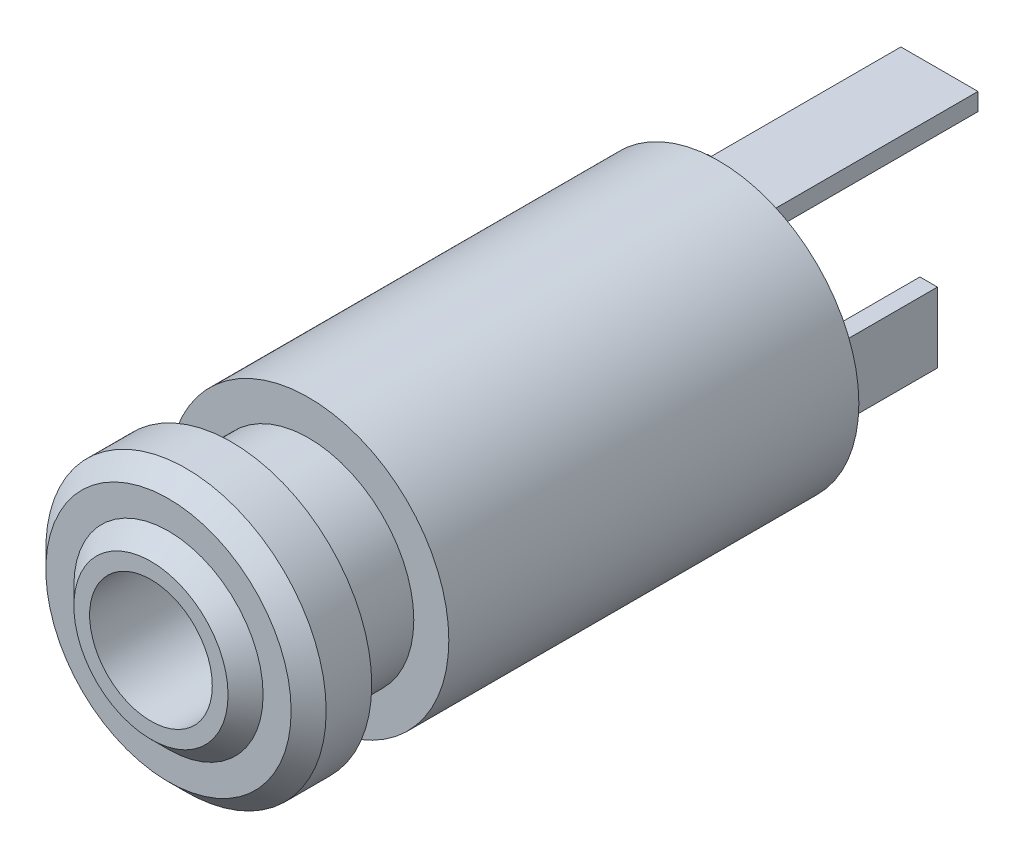
ISO-10303-21;
HEADER;
FILE_DESCRIPTION(('STEP AP214'),'2;1');
FILE_NAME('part.step','',(''),(''),'','','');
FILE_SCHEMA(('AUTOMOTIVE_DESIGN { 1 0 10303 214 1 1 1 1 }'));
ENDSEC;
DATA;
#1=APPLICATION_CONTEXT('core data for automotive mechanical design processes');
#2=APPLICATION_PROTOCOL_DEFINITION('international standard','automotive_design',2000,#1);
#3=PRODUCT_CONTEXT('',#1,'mechanical');
#4=PRODUCT('Part','Part','',(#3));
#5=PRODUCT_RELATED_PRODUCT_CATEGORY('part','',(#4));
#6=PRODUCT_DEFINITION_FORMATION('','',#4);
#7=PRODUCT_DEFINITION_CONTEXT('part definition',#1,'design');
#8=PRODUCT_DEFINITION('design','',#6,#7);
#9=PRODUCT_DEFINITION_SHAPE('','',#8);
#10=(LENGTH_UNIT() NAMED_UNIT(*) SI_UNIT(.MILLI.,.METRE.));
#11=(NAMED_UNIT(*) PLANE_ANGLE_UNIT() SI_UNIT($,.RADIAN.));
#12=(NAMED_UNIT(*) SI_UNIT($,.STERADIAN.) SOLID_ANGLE_UNIT());
#13=UNCERTAINTY_MEASURE_WITH_UNIT(LENGTH_MEASURE(1.E-05),#10,'distance_accuracy_value','');
#14=(GEOMETRIC_REPRESENTATION_CONTEXT(3) GLOBAL_UNCERTAINTY_ASSIGNED_CONTEXT((#13)) GLOBAL_UNIT_ASSIGNED_CONTEXT((#10,
#11,#12)) REPRESENTATION_CONTEXT('',''));
#15=CARTESIAN_POINT('',(0.,0.,0.));
#16=DIRECTION('',(0.,0.,1.));
#17=DIRECTION('',(1.,0.,0.));
#18=AXIS2_PLACEMENT_3D('',#15,#16,#17);
#19=CARTESIAN_POINT('',(0.,4.,-16.2));
#20=DIRECTION('',(0.,0.,1.));
#21=DIRECTION('',(1.,0.,0.));
#22=AXIS2_PLACEMENT_3D('',#19,#20,#21);
#23=PLANE('',#22);
#24=DIRECTION('',(0.,-1.,0.));
#25=VECTOR('',#24,1.);
#26=CARTESIAN_POINT('',(1.1,3.11281666914263,-16.2));
#27=LINE('',#26,#25);
#28=CARTESIAN_POINT('',(1.1,3.11281666914263,-16.2));
#29=VERTEX_POINT('',#28);
#30=CARTESIAN_POINT('',(1.1,2.61281666914263,-16.2));
#31=VERTEX_POINT('',#30);
#32=EDGE_CURVE('E188',#29,#31,#27,.T.);
#33=ORIENTED_EDGE('',*,*,#32,.F.);
#34=DIRECTION('',(1.,0.,0.));
#35=VECTOR('',#34,1.);
#36=CARTESIAN_POINT('',(1.1,3.11281666914263,-16.2));
#37=LINE('',#36,#35);
#38=CARTESIAN_POINT('',(-1.1,3.11281666914263,-16.2));
#39=VERTEX_POINT('',#38);
#40=EDGE_CURVE('E134',#39,#29,#37,.T.);
#41=ORIENTED_EDGE('',*,*,#40,.F.);
#42=DIRECTION('',(0.,1.,0.));
#43=VECTOR('',#42,1.);
#44=CARTESIAN_POINT('',(-1.1,3.11281666914263,-16.2));
#45=LINE('',#44,#43);
#46=CARTESIAN_POINT('',(-1.1,2.61281666914263,-16.2));
#47=VERTEX_POINT('',#46);
#48=EDGE_CURVE('E193',#47,#39,#45,.T.);
#49=ORIENTED_EDGE('',*,*,#48,.F.);
#50=DIRECTION('',(-1.,0.,0.));
#51=VECTOR('',#50,1.);
#52=CARTESIAN_POINT('',(1.1,2.61281666914263,-16.2));
#53=LINE('',#52,#51);
#54=EDGE_CURVE('E190',#31,#47,#53,.T.);
#55=ORIENTED_EDGE('',*,*,#54,.F.);
#56=EDGE_LOOP('',(#33,#41,#49,#55));
#57=FACE_BOUND('',#56,.T.);
#58=CARTESIAN_POINT('',(0.,0.,-16.2));
#59=DIRECTION('',(0.,0.,1.));
#60=DIRECTION('',(1.,0.,0.));
#61=AXIS2_PLACEMENT_3D('',#58,#59,#60);
#62=CIRCLE('',#61,4.);
#63=CARTESIAN_POINT('',(4.,0.,-16.2));
#64=VERTEX_POINT('',#63);
#65=EDGE_CURVE('E252',#64,#64,#62,.T.);
#66=ORIENTED_EDGE('',*,*,#65,.F.);
#67=EDGE_LOOP('',(#66));
#68=FACE_BOUND('',#67,.T.);
#69=DIRECTION('',(1.,0.,0.));
#70=VECTOR('',#69,1.);
#71=CARTESIAN_POINT('',(3.24320910821166,1.,-16.2));
#72=LINE('',#71,#70);
#73=CARTESIAN_POINT('',(2.74320910821166,1.,-16.2));
#74=VERTEX_POINT('',#73);
#75=CARTESIAN_POINT('',(3.24320910821166,1.,-16.2));
#76=VERTEX_POINT('',#75);
#77=EDGE_CURVE('E203',#74,#76,#72,.T.);
#78=ORIENTED_EDGE('',*,*,#77,.F.);
#79=DIRECTION('',(0.,1.,0.));
#80=VECTOR('',#79,1.);
#81=CARTESIAN_POINT('',(2.74320910821166,1.,-16.2));
#82=LINE('',#81,#80);
#83=CARTESIAN_POINT('',(2.74320910821166,-1.,-16.2));
#84=VERTEX_POINT('',#83);
#85=EDGE_CURVE('E208',#84,#74,#82,.T.);
#86=ORIENTED_EDGE('',*,*,#85,.F.);
#87=DIRECTION('',(-1.,0.,0.));
#88=VECTOR('',#87,1.);
#89=CARTESIAN_POINT('',(3.24320910821166,-1.,-16.2));
#90=LINE('',#89,#88);
#91=CARTESIAN_POINT('',(3.24320910821166,-1.,-16.2));
#92=VERTEX_POINT('',#91);
#93=EDGE_CURVE('E220',#92,#84,#90,.T.);
#94=ORIENTED_EDGE('',*,*,#93,.F.);
#95=DIRECTION('',(0.,-1.,0.));
#96=VECTOR('',#95,1.);
#97=CARTESIAN_POINT('',(3.24320910821166,1.,-16.2));
#98=LINE('',#97,#96);
#99=EDGE_CURVE('E217',#76,#92,#98,.T.);
#100=ORIENTED_EDGE('',*,*,#99,.F.);
#101=EDGE_LOOP('',(#78,#86,#94,#100));
#102=FACE_BOUND('',#101,.T.);
#103=DIRECTION('',(1.,0.,0.));
#104=VECTOR('',#103,1.);
#105=CARTESIAN_POINT('',(-2.6738017116088,1.,-16.2));
#106=LINE('',#105,#104);
#107=CARTESIAN_POINT('',(-3.31261650481451,1.,-16.2));
#108=VERTEX_POINT('',#107);
#109=CARTESIAN_POINT('',(-2.6738017116088,1.,-16.2));
#110=VERTEX_POINT('',#109);
#111=EDGE_CURVE('E157',#108,#110,#106,.T.);
#112=ORIENTED_EDGE('',*,*,#111,.F.);
#113=DIRECTION('',(0.,1.,0.));
#114=VECTOR('',#113,1.);
#115=CARTESIAN_POINT('',(-3.31261650481451,1.,-16.2));
#116=LINE('',#115,#114);
#117=CARTESIAN_POINT('',(-3.31261650481452,-0.999999999999999,-16.2));
#118=VERTEX_POINT('',#117);
#119=EDGE_CURVE('E162',#118,#108,#116,.T.);
#120=ORIENTED_EDGE('',*,*,#119,.F.);
#121=DIRECTION('',(-1.,0.,0.));
#122=VECTOR('',#121,1.);
#123=CARTESIAN_POINT('',(-2.6738017116088,-1.,-16.2));
#124=LINE('',#123,#122);
#125=CARTESIAN_POINT('',(-2.6738017116088,-1.,-16.2));
#126=VERTEX_POINT('',#125);
#127=EDGE_CURVE('E60',#126,#118,#124,.T.);
#128=ORIENTED_EDGE('',*,*,#127,.F.);
#129=DIRECTION('',(0.,-1.,0.));
#130=VECTOR('',#129,1.);
#131=CARTESIAN_POINT('',(-2.6738017116088,1.,-16.2));
#132=LINE('',#131,#130);
#133=EDGE_CURVE('E55',#110,#126,#132,.T.);
#134=ORIENTED_EDGE('',*,*,#133,.F.);
#135=EDGE_LOOP('',(#112,#120,#128,#134));
#136=FACE_BOUND('',#135,.T.);
#137=ADVANCED_FACE('F39',(#57,#68,#102,#136),#23,.F.);
#138=CARTESIAN_POINT('',(0.,1.75,-13.508423886849));
#139=DIRECTION('',(0.,0.,-1.));
#140=DIRECTION('',(-1.,0.,0.));
#141=AXIS2_PLACEMENT_3D('',#138,#139,#140);
#142=PLANE('',#141);
#143=CARTESIAN_POINT('',(0.,0.,-13.508423886849));
#144=DIRECTION('',(0.,0.,1.));
#145=DIRECTION('',(1.,0.,0.));
#146=AXIS2_PLACEMENT_3D('',#143,#144,#145);
#147=CIRCLE('',#146,1.75);
#148=CARTESIAN_POINT('',(1.75,0.,-13.508423886849));
#149=VERTEX_POINT('',#148);
#150=EDGE_CURVE('E249',#149,#149,#147,.T.);
#151=ORIENTED_EDGE('',*,*,#150,.T.);
#152=EDGE_LOOP('',(#151));
#153=FACE_BOUND('',#152,.T.);
#154=ADVANCED_FACE('F285',(#153),#142,.F.);
#155=CARTESIAN_POINT('',(0.,0.,3.98507462686567));
#156=DIRECTION('',(0.,0.,1.));
#157=DIRECTION('',(1.,0.,0.));
#158=AXIS2_PLACEMENT_3D('',#155,#156,#157);
#159=CYLINDRICAL_SURFACE('',#158,1.75);
#160=ORIENTED_EDGE('',*,*,#150,.F.);
#161=EDGE_LOOP('',(#160));
#162=FACE_BOUND('',#161,.T.);
#163=CARTESIAN_POINT('',(0.,0.,0.));
#164=DIRECTION('',(0.,0.,1.));
#165=DIRECTION('',(1.,0.,0.));
#166=AXIS2_PLACEMENT_3D('',#163,#164,#165);
#167=CIRCLE('',#166,1.75);
#168=CARTESIAN_POINT('',(1.75,0.,0.));
#169=VERTEX_POINT('',#168);
#170=EDGE_CURVE('E246',#169,#169,#167,.T.);
#171=ORIENTED_EDGE('',*,*,#170,.T.);
#172=EDGE_LOOP('',(#171));
#173=FACE_BOUND('',#172,.T.);
#174=ADVANCED_FACE('F292',(#162,#173),#159,.F.);
#175=CARTESIAN_POINT('',(0.,1.75,0.));
#176=DIRECTION('',(0.,0.,-1.));
#177=DIRECTION('',(-1.,0.,0.));
#178=AXIS2_PLACEMENT_3D('',#175,#176,#177);
#179=PLANE('',#178);
#180=ORIENTED_EDGE('',*,*,#170,.F.);
#181=EDGE_LOOP('',(#180));
#182=FACE_BOUND('',#181,.T.);
#183=CARTESIAN_POINT('',(0.,0.,0.));
#184=DIRECTION('',(0.,0.,1.));
#185=DIRECTION('',(1.,0.,0.));
#186=AXIS2_PLACEMENT_3D('',#183,#184,#185);
#187=CIRCLE('',#186,2.2);
#188=CARTESIAN_POINT('',(2.2,0.,0.));
#189=VERTEX_POINT('',#188);
#190=EDGE_CURVE('E243',#189,#189,#187,.T.);
#191=ORIENTED_EDGE('',*,*,#190,.T.);
#192=EDGE_LOOP('',(#191));
#193=FACE_BOUND('',#192,.T.);
#194=ADVANCED_FACE('F378',(#182,#193),#179,.F.);
#195=CARTESIAN_POINT('',(0.,0.,-0.8));
#196=DIRECTION('',(0.,0.,-1.));
#197=DIRECTION('',(-1.,0.,0.));
#198=AXIS2_PLACEMENT_3D('',#195,#196,#197);
#199=CONICAL_SURFACE('',#198,3.,0.785398163397448);
#200=CARTESIAN_POINT('',(0.,0.,-0.5));
#201=DIRECTION('',(0.,0.,1.));
#202=DIRECTION('',(1.,0.,0.));
#203=AXIS2_PLACEMENT_3D('',#200,#201,#202);
#204=CIRCLE('',#203,2.7);
#205=CARTESIAN_POINT('',(2.7,0.,-0.5));
#206=VERTEX_POINT('',#205);
#207=EDGE_CURVE('E239',#206,#206,#204,.T.);
#208=ORIENTED_EDGE('',*,*,#207,.T.);
#209=EDGE_LOOP('',(#208));
#210=FACE_BOUND('',#209,.T.);
#211=ORIENTED_EDGE('',*,*,#190,.F.);
#212=EDGE_LOOP('',(#211));
#213=FACE_BOUND('',#212,.T.);
#214=ADVANCED_FACE('F373',(#210,#213),#199,.T.);
#215=CARTESIAN_POINT('',(0.,0.,-2.3));
#216=DIRECTION('',(0.,0.,1.));
#217=DIRECTION('',(1.,0.,0.));
#218=AXIS2_PLACEMENT_3D('',#215,#216,#217);
#219=CYLINDRICAL_SURFACE('',#218,4.);
#220=CARTESIAN_POINT('',(0.,0.,-1.));
#221=DIRECTION('',(0.,0.,1.));
#222=DIRECTION('',(1.,0.,0.));
#223=AXIS2_PLACEMENT_3D('',#220,#221,#222);
#224=CIRCLE('',#223,4.);
#225=CARTESIAN_POINT('',(4.,0.,-1.));
#226=VERTEX_POINT('',#225);
#227=EDGE_CURVE('E11',#226,#226,#224,.F.);
#228=ORIENTED_EDGE('',*,*,#227,.T.);
#229=EDGE_LOOP('',(#228));
#230=FACE_BOUND('',#229,.T.);
#231=CARTESIAN_POINT('',(0.,0.,-2.3));
#232=DIRECTION('',(0.,0.,1.));
#233=DIRECTION('',(1.,0.,0.));
#234=AXIS2_PLACEMENT_3D('',#231,#232,#233);
#235=CIRCLE('',#234,4.);
#236=CARTESIAN_POINT('',(4.,0.,-2.3));
#237=VERTEX_POINT('',#236);
#238=EDGE_CURVE('E236',#237,#237,#235,.T.);
#239=ORIENTED_EDGE('',*,*,#238,.T.);
#240=EDGE_LOOP('',(#239));
#241=FACE_BOUND('',#240,.T.);
#242=ADVANCED_FACE('F368',(#230,#241),#219,.T.);
#243=CARTESIAN_POINT('',(0.,0.,-2.3));
#244=DIRECTION('',(0.,0.,1.));
#245=DIRECTION('',(1.,0.,0.));
#246=AXIS2_PLACEMENT_3D('',#243,#244,#245);
#247=PLANE('',#246);
#248=CARTESIAN_POINT('',(0.,0.,-2.3));
#249=DIRECTION('',(0.,0.,1.));
#250=DIRECTION('',(1.,0.,0.));
#251=AXIS2_PLACEMENT_3D('',#248,#249,#250);
#252=CIRCLE('',#251,3.);
#253=CARTESIAN_POINT('',(3.,0.,-2.3));
#254=VERTEX_POINT('',#253);
#255=EDGE_CURVE('E258',#254,#254,#252,.T.);
#256=ORIENTED_EDGE('',*,*,#255,.T.);
#257=EDGE_LOOP('',(#256));
#258=FACE_BOUND('',#257,.T.);
#259=ORIENTED_EDGE('',*,*,#238,.F.);
#260=EDGE_LOOP('',(#259));
#261=FACE_BOUND('',#260,.T.);
#262=ADVANCED_FACE('F365',(#258,#261),#247,.F.);
#263=CARTESIAN_POINT('',(0.,0.,-0.5));
#264=DIRECTION('',(0.,0.,1.));
#265=DIRECTION('',(1.,0.,0.));
#266=AXIS2_PLACEMENT_3D('',#263,#264,#265);
#267=PLANE('',#266);
#268=CARTESIAN_POINT('',(0.,0.,-0.5));
#269=DIRECTION('',(0.,0.,1.));
#270=DIRECTION('',(1.,0.,0.));
#271=AXIS2_PLACEMENT_3D('',#268,#269,#270);
#272=CIRCLE('',#271,3.5);
#273=CARTESIAN_POINT('',(3.5,0.,-0.5));
#274=VERTEX_POINT('',#273);
#275=EDGE_CURVE('E47',#274,#274,#272,.T.);
#276=ORIENTED_EDGE('',*,*,#275,.T.);
#277=EDGE_LOOP('',(#276));
#278=FACE_BOUND('',#277,.T.);
#279=ORIENTED_EDGE('',*,*,#207,.F.);
#280=EDGE_LOOP('',(#279));
#281=FACE_BOUND('',#280,.T.);
#282=ADVANCED_FACE('F265',(#278,#281),#267,.T.);
#283=CARTESIAN_POINT('',(0.,0.,3.98507462686567));
#284=DIRECTION('',(0.,0.,1.));
#285=DIRECTION('',(1.,0.,0.));
#286=AXIS2_PLACEMENT_3D('',#283,#284,#285);
#287=CYLINDRICAL_SURFACE('',#286,4.);
#288=CARTESIAN_POINT('',(0.,0.,-4.5));
#289=DIRECTION('',(0.,0.,1.));
#290=DIRECTION('',(1.,0.,0.));
#291=AXIS2_PLACEMENT_3D('',#288,#289,#290);
#292=CIRCLE('',#291,4.);
#293=CARTESIAN_POINT('',(4.,0.,-4.5));
#294=VERTEX_POINT('',#293);
#295=EDGE_CURVE('E255',#294,#294,#292,.T.);
#296=ORIENTED_EDGE('',*,*,#295,.F.);
#297=EDGE_LOOP('',(#296));
#298=FACE_BOUND('',#297,.T.);
#299=ORIENTED_EDGE('',*,*,#65,.T.);
#300=EDGE_LOOP('',(#299));
#301=FACE_BOUND('',#300,.T.);
#302=ADVANCED_FACE('F298',(#298,#301),#287,.T.);
#303=CARTESIAN_POINT('',(0.,3.,-4.5));
#304=DIRECTION('',(0.,0.,-1.));
#305=DIRECTION('',(-1.,0.,0.));
#306=AXIS2_PLACEMENT_3D('',#303,#304,#305);
#307=PLANE('',#306);
#308=CARTESIAN_POINT('',(0.,0.,-4.5));
#309=DIRECTION('',(0.,0.,1.));
#310=DIRECTION('',(1.,0.,0.));
#311=AXIS2_PLACEMENT_3D('',#308,#309,#310);
#312=CIRCLE('',#311,3.);
#313=CARTESIAN_POINT('',(3.,0.,-4.5));
#314=VERTEX_POINT('',#313);
#315=EDGE_CURVE('E240',#314,#314,#312,.T.);
#316=ORIENTED_EDGE('',*,*,#315,.F.);
#317=EDGE_LOOP('',(#316));
#318=FACE_BOUND('',#317,.T.);
#319=ORIENTED_EDGE('',*,*,#295,.T.);
#320=EDGE_LOOP('',(#319));
#321=FACE_BOUND('',#320,.T.);
#322=ADVANCED_FACE('F280',(#318,#321),#307,.F.);
#323=CARTESIAN_POINT('',(0.,0.,3.98507462686567));
#324=DIRECTION('',(0.,0.,1.));
#325=DIRECTION('',(1.,0.,0.));
#326=AXIS2_PLACEMENT_3D('',#323,#324,#325);
#327=CYLINDRICAL_SURFACE('',#326,3.);
#328=ORIENTED_EDGE('',*,*,#315,.T.);
#329=EDGE_LOOP('',(#328));
#330=FACE_BOUND('',#329,.T.);
#331=ORIENTED_EDGE('',*,*,#255,.F.);
#332=EDGE_LOOP('',(#331));
#333=FACE_BOUND('',#332,.T.);
#334=ADVANCED_FACE('F270',(#330,#333),#327,.T.);
#335=CARTESIAN_POINT('',(0.,0.,-0.5));
#336=DIRECTION('',(0.,0.,-1.));
#337=DIRECTION('',(-1.,0.,0.));
#338=AXIS2_PLACEMENT_3D('',#335,#336,#337);
#339=CONICAL_SURFACE('',#338,3.5,0.785398163397445);
#340=ORIENTED_EDGE('',*,*,#227,.F.);
#341=EDGE_LOOP('',(#340));
#342=FACE_BOUND('',#341,.T.);
#343=ORIENTED_EDGE('',*,*,#275,.F.);
#344=EDGE_LOOP('',(#343));
#345=FACE_BOUND('',#344,.T.);
#346=ADVANCED_FACE('F41',(#342,#345),#339,.T.);
#347=CARTESIAN_POINT('',(3.24320910821166,1.,-19.2));
#348=DIRECTION('',(0.,-1.,0.));
#349=DIRECTION('',(1.,0.,0.));
#350=AXIS2_PLACEMENT_3D('',#347,#348,#349);
#351=PLANE('',#350);
#352=ORIENTED_EDGE('',*,*,#77,.T.);
#353=DIRECTION('',(0.,0.,1.));
#354=VECTOR('',#353,1.);
#355=CARTESIAN_POINT('',(3.24320910821166,1.,-19.2));
#356=LINE('',#355,#354);
#357=CARTESIAN_POINT('',(3.24320910821166,1.,-19.2));
#358=VERTEX_POINT('',#357);
#359=EDGE_CURVE('E233',#358,#76,#356,.T.);
#360=ORIENTED_EDGE('',*,*,#359,.F.);
#361=DIRECTION('',(1.,0.,0.));
#362=VECTOR('',#361,1.);
#363=CARTESIAN_POINT('',(3.24320910821166,1.,-19.2));
#364=LINE('',#363,#362);
#365=CARTESIAN_POINT('',(2.74320910821166,1.,-19.2));
#366=VERTEX_POINT('',#365);
#367=EDGE_CURVE('E204',#366,#358,#364,.T.);
#368=ORIENTED_EDGE('',*,*,#367,.F.);
#369=DIRECTION('',(0.,0.,1.));
#370=VECTOR('',#369,1.);
#371=CARTESIAN_POINT('',(2.74320910821166,1.,-19.2));
#372=LINE('',#371,#370);
#373=EDGE_CURVE('E214',#366,#74,#372,.T.);
#374=ORIENTED_EDGE('',*,*,#373,.T.);
#375=EDGE_LOOP('',(#352,#360,#368,#374));
#376=FACE_BOUND('',#375,.T.);
#377=ADVANCED_FACE('F269',(#376),#351,.F.);
#378=CARTESIAN_POINT('',(3.24320910821166,1.,-19.2));
#379=DIRECTION('',(-1.,0.,0.));
#380=DIRECTION('',(0.,-1.,0.));
#381=AXIS2_PLACEMENT_3D('',#378,#379,#380);
#382=PLANE('',#381);
#383=ORIENTED_EDGE('',*,*,#99,.T.);
#384=DIRECTION('',(0.,0.,1.));
#385=VECTOR('',#384,1.);
#386=CARTESIAN_POINT('',(3.24320910821166,-1.,-19.2));
#387=LINE('',#386,#385);
#388=CARTESIAN_POINT('',(3.24320910821166,-1.,-19.2));
#389=VERTEX_POINT('',#388);
#390=EDGE_CURVE('E230',#389,#92,#387,.T.);
#391=ORIENTED_EDGE('',*,*,#390,.F.);
#392=DIRECTION('',(0.,-1.,0.));
#393=VECTOR('',#392,1.);
#394=CARTESIAN_POINT('',(3.24320910821166,1.,-19.2));
#395=LINE('',#394,#393);
#396=EDGE_CURVE('E207',#358,#389,#395,.T.);
#397=ORIENTED_EDGE('',*,*,#396,.F.);
#398=ORIENTED_EDGE('',*,*,#359,.T.);
#399=EDGE_LOOP('',(#383,#391,#397,#398));
#400=FACE_BOUND('',#399,.T.);
#401=ADVANCED_FACE('F277',(#400),#382,.F.);
#402=CARTESIAN_POINT('',(3.24320910821166,-1.,-19.2));
#403=DIRECTION('',(0.,1.,0.));
#404=DIRECTION('',(-1.,0.,0.));
#405=AXIS2_PLACEMENT_3D('',#402,#403,#404);
#406=PLANE('',#405);
#407=ORIENTED_EDGE('',*,*,#93,.T.);
#408=DIRECTION('',(0.,0.,1.));
#409=VECTOR('',#408,1.);
#410=CARTESIAN_POINT('',(2.74320910821166,-1.,-19.2));
#411=LINE('',#410,#409);
#412=CARTESIAN_POINT('',(2.74320910821166,-1.,-19.2));
#413=VERTEX_POINT('',#412);
#414=EDGE_CURVE('E227',#413,#84,#411,.T.);
#415=ORIENTED_EDGE('',*,*,#414,.F.);
#416=DIRECTION('',(-1.,0.,0.));
#417=VECTOR('',#416,1.);
#418=CARTESIAN_POINT('',(3.24320910821166,-1.,-19.2));
#419=LINE('',#418,#417);
#420=EDGE_CURVE('E210',#389,#413,#419,.T.);
#421=ORIENTED_EDGE('',*,*,#420,.F.);
#422=ORIENTED_EDGE('',*,*,#390,.T.);
#423=EDGE_LOOP('',(#407,#415,#421,#422));
#424=FACE_BOUND('',#423,.T.);
#425=ADVANCED_FACE('F357',(#424),#406,.F.);
#426=CARTESIAN_POINT('',(2.74320910821166,1.,-19.2));
#427=DIRECTION('',(1.,0.,0.));
#428=DIRECTION('',(0.,0.,-1.));
#429=AXIS2_PLACEMENT_3D('',#426,#427,#428);
#430=PLANE('',#429);
#431=ORIENTED_EDGE('',*,*,#85,.T.);
#432=ORIENTED_EDGE('',*,*,#373,.F.);
#433=DIRECTION('',(0.,1.,0.));
#434=VECTOR('',#433,1.);
#435=CARTESIAN_POINT('',(2.74320910821166,1.,-19.2));
#436=LINE('',#435,#434);
#437=EDGE_CURVE('E212',#413,#366,#436,.T.);
#438=ORIENTED_EDGE('',*,*,#437,.F.);
#439=ORIENTED_EDGE('',*,*,#414,.T.);
#440=EDGE_LOOP('',(#431,#432,#438,#439));
#441=FACE_BOUND('',#440,.T.);
#442=ADVANCED_FACE('F353',(#441),#430,.F.);
#443=CARTESIAN_POINT('',(0.,0.,-19.2));
#444=DIRECTION('',(0.,0.,1.));
#445=DIRECTION('',(1.,0.,0.));
#446=AXIS2_PLACEMENT_3D('',#443,#444,#445);
#447=PLANE('',#446);
#448=ORIENTED_EDGE('',*,*,#367,.T.);
#449=ORIENTED_EDGE('',*,*,#396,.T.);
#450=ORIENTED_EDGE('',*,*,#420,.T.);
#451=ORIENTED_EDGE('',*,*,#437,.T.);
#452=EDGE_LOOP('',(#448,#449,#450,#451));
#453=FACE_BOUND('',#452,.T.);
#454=ADVANCED_FACE('F350',(#453),#447,.F.);
#455=CARTESIAN_POINT('',(1.1,3.11281666914263,-19.2));
#456=DIRECTION('',(-1.,0.,0.));
#457=DIRECTION('',(0.,0.,1.));
#458=AXIS2_PLACEMENT_3D('',#455,#456,#457);
#459=PLANE('',#458);
#460=ORIENTED_EDGE('',*,*,#32,.T.);
#461=DIRECTION('',(0.,0.,1.));
#462=VECTOR('',#461,1.);
#463=CARTESIAN_POINT('',(1.1,2.61281666914263,-19.2));
#464=LINE('',#463,#462);
#465=CARTESIAN_POINT('',(1.1,2.61281666914263,-22.5));
#466=VERTEX_POINT('',#465);
#467=EDGE_CURVE('E143',#466,#31,#464,.T.);
#468=ORIENTED_EDGE('',*,*,#467,.F.);
#469=DIRECTION('',(0.,-1.,0.));
#470=VECTOR('',#469,1.);
#471=CARTESIAN_POINT('',(1.1,3.11281666914263,-22.5));
#472=LINE('',#471,#470);
#473=CARTESIAN_POINT('',(1.1,3.11281666914263,-22.5));
#474=VERTEX_POINT('',#473);
#475=EDGE_CURVE('E140',#474,#466,#472,.T.);
#476=ORIENTED_EDGE('',*,*,#475,.F.);
#477=DIRECTION('',(0.,0.,1.));
#478=VECTOR('',#477,1.);
#479=CARTESIAN_POINT('',(1.1,3.11281666914263,-19.2));
#480=LINE('',#479,#478);
#481=EDGE_CURVE('E128',#474,#29,#480,.T.);
#482=ORIENTED_EDGE('',*,*,#481,.T.);
#483=EDGE_LOOP('',(#460,#468,#476,#482));
#484=FACE_BOUND('',#483,.T.);
#485=ADVANCED_FACE('F141',(#484),#459,.F.);
#486=CARTESIAN_POINT('',(1.1,2.61281666914263,-19.2));
#487=DIRECTION('',(0.,1.,0.));
#488=DIRECTION('',(0.,0.,1.));
#489=AXIS2_PLACEMENT_3D('',#486,#487,#488);
#490=PLANE('',#489);
#491=ORIENTED_EDGE('',*,*,#54,.T.);
#492=DIRECTION('',(0.,0.,1.));
#493=VECTOR('',#492,1.);
#494=CARTESIAN_POINT('',(-1.1,2.61281666914263,-19.2));
#495=LINE('',#494,#493);
#496=CARTESIAN_POINT('',(-1.1,2.61281666914263,-22.5));
#497=VERTEX_POINT('',#496);
#498=EDGE_CURVE('E198',#497,#47,#495,.T.);
#499=ORIENTED_EDGE('',*,*,#498,.F.);
#500=DIRECTION('',(-1.,0.,0.));
#501=VECTOR('',#500,1.);
#502=CARTESIAN_POINT('',(1.1,2.61281666914263,-22.5));
#503=LINE('',#502,#501);
#504=EDGE_CURVE('E147',#466,#497,#503,.T.);
#505=ORIENTED_EDGE('',*,*,#504,.F.);
#506=ORIENTED_EDGE('',*,*,#467,.T.);
#507=EDGE_LOOP('',(#491,#499,#505,#506));
#508=FACE_BOUND('',#507,.T.);
#509=ADVANCED_FACE('F343',(#508),#490,.F.);
#510=CARTESIAN_POINT('',(-1.1,3.11281666914263,-19.2));
#511=DIRECTION('',(1.,0.,0.));
#512=DIRECTION('',(0.,0.,-1.));
#513=AXIS2_PLACEMENT_3D('',#510,#511,#512);
#514=PLANE('',#513);
#515=ORIENTED_EDGE('',*,*,#48,.T.);
#516=DIRECTION('',(0.,0.,1.));
#517=VECTOR('',#516,1.);
#518=CARTESIAN_POINT('',(-1.1,3.11281666914263,-19.2));
#519=LINE('',#518,#517);
#520=CARTESIAN_POINT('',(-1.1,3.11281666914263,-22.5));
#521=VERTEX_POINT('',#520);
#522=EDGE_CURVE('E137',#521,#39,#519,.T.);
#523=ORIENTED_EDGE('',*,*,#522,.F.);
#524=DIRECTION('',(0.,1.,0.));
#525=VECTOR('',#524,1.);
#526=CARTESIAN_POINT('',(-1.1,2.61281666914263,-22.5));
#527=LINE('',#526,#525);
#528=EDGE_CURVE('E152',#497,#521,#527,.T.);
#529=ORIENTED_EDGE('',*,*,#528,.F.);
#530=ORIENTED_EDGE('',*,*,#498,.T.);
#531=EDGE_LOOP('',(#515,#523,#529,#530));
#532=FACE_BOUND('',#531,.T.);
#533=ADVANCED_FACE('F340',(#532),#514,.F.);
#534=CARTESIAN_POINT('',(1.1,3.11281666914263,-19.2));
#535=DIRECTION('',(0.,-1.,0.));
#536=DIRECTION('',(0.,0.,-1.));
#537=AXIS2_PLACEMENT_3D('',#534,#535,#536);
#538=PLANE('',#537);
#539=ORIENTED_EDGE('',*,*,#40,.T.);
#540=ORIENTED_EDGE('',*,*,#481,.F.);
#541=DIRECTION('',(1.,0.,0.));
#542=VECTOR('',#541,1.);
#543=CARTESIAN_POINT('',(-1.1,3.11281666914263,-22.5));
#544=LINE('',#543,#542);
#545=EDGE_CURVE('E133',#521,#474,#544,.T.);
#546=ORIENTED_EDGE('',*,*,#545,.F.);
#547=ORIENTED_EDGE('',*,*,#522,.T.);
#548=EDGE_LOOP('',(#539,#540,#546,#547));
#549=FACE_BOUND('',#548,.T.);
#550=ADVANCED_FACE('F130',(#549),#538,.F.);
#551=CARTESIAN_POINT('',(-2.6738017116088,1.,-19.2));
#552=DIRECTION('',(0.,-1.,0.));
#553=DIRECTION('',(1.,0.,0.));
#554=AXIS2_PLACEMENT_3D('',#551,#552,#553);
#555=PLANE('',#554);
#556=ORIENTED_EDGE('',*,*,#111,.T.);
#557=DIRECTION('',(0.,0.,1.));
#558=VECTOR('',#557,1.);
#559=CARTESIAN_POINT('',(-2.6738017116088,1.,-19.2));
#560=LINE('',#559,#558);
#561=CARTESIAN_POINT('',(-2.6738017116088,1.,-19.2));
#562=VERTEX_POINT('',#561);
#563=EDGE_CURVE('E185',#562,#110,#560,.T.);
#564=ORIENTED_EDGE('',*,*,#563,.F.);
#565=DIRECTION('',(1.,0.,0.));
#566=VECTOR('',#565,1.);
#567=CARTESIAN_POINT('',(-2.6738017116088,1.,-19.2));
#568=LINE('',#567,#566);
#569=CARTESIAN_POINT('',(-3.31261650481451,1.,-19.2));
#570=VERTEX_POINT('',#569);
#571=EDGE_CURVE('E158',#570,#562,#568,.T.);
#572=ORIENTED_EDGE('',*,*,#571,.F.);
#573=DIRECTION('',(0.,0.,1.));
#574=VECTOR('',#573,1.);
#575=CARTESIAN_POINT('',(-3.31261650481451,1.,-19.2));
#576=LINE('',#575,#574);
#577=EDGE_CURVE('E168',#570,#108,#576,.T.);
#578=ORIENTED_EDGE('',*,*,#577,.T.);
#579=EDGE_LOOP('',(#556,#564,#572,#578));
#580=FACE_BOUND('',#579,.T.);
#581=ADVANCED_FACE('F319',(#580),#555,.F.);
#582=CARTESIAN_POINT('',(-2.6738017116088,1.,-19.2));
#583=DIRECTION('',(-1.,0.,0.));
#584=DIRECTION('',(0.,-1.,0.));
#585=AXIS2_PLACEMENT_3D('',#582,#583,#584);
#586=PLANE('',#585);
#587=ORIENTED_EDGE('',*,*,#133,.T.);
#588=DIRECTION('',(0.,0.,1.));
#589=VECTOR('',#588,1.);
#590=CARTESIAN_POINT('',(-2.6738017116088,-1.,-19.2));
#591=LINE('',#590,#589);
#592=CARTESIAN_POINT('',(-2.6738017116088,-1.,-19.2));
#593=VERTEX_POINT('',#592);
#594=EDGE_CURVE('E182',#593,#126,#591,.T.);
#595=ORIENTED_EDGE('',*,*,#594,.F.);
#596=DIRECTION('',(0.,-1.,0.));
#597=VECTOR('',#596,1.);
#598=CARTESIAN_POINT('',(-2.6738017116088,1.,-19.2));
#599=LINE('',#598,#597);
#600=EDGE_CURVE('E161',#562,#593,#599,.T.);
#601=ORIENTED_EDGE('',*,*,#600,.F.);
#602=ORIENTED_EDGE('',*,*,#563,.T.);
#603=EDGE_LOOP('',(#587,#595,#601,#602));
#604=FACE_BOUND('',#603,.T.);
#605=ADVANCED_FACE('F327',(#604),#586,.F.);
#606=CARTESIAN_POINT('',(-2.6738017116088,-1.,-19.2));
#607=DIRECTION('',(0.,1.,0.));
#608=DIRECTION('',(-1.,0.,0.));
#609=AXIS2_PLACEMENT_3D('',#606,#607,#608);
#610=PLANE('',#609);
#611=ORIENTED_EDGE('',*,*,#127,.T.);
#612=DIRECTION('',(0.,0.,1.));
#613=VECTOR('',#612,1.);
#614=CARTESIAN_POINT('',(-3.31261650481452,-0.999999999999999,-19.2));
#615=LINE('',#614,#613);
#616=CARTESIAN_POINT('',(-3.31261650481452,-0.999999999999999,-19.2));
#617=VERTEX_POINT('',#616);
#618=EDGE_CURVE('E179',#617,#118,#615,.T.);
#619=ORIENTED_EDGE('',*,*,#618,.F.);
#620=DIRECTION('',(-1.,0.,0.));
#621=VECTOR('',#620,1.);
#622=CARTESIAN_POINT('',(-2.6738017116088,-1.,-19.2));
#623=LINE('',#622,#621);
#624=EDGE_CURVE('E164',#593,#617,#623,.T.);
#625=ORIENTED_EDGE('',*,*,#624,.F.);
#626=ORIENTED_EDGE('',*,*,#594,.T.);
#627=EDGE_LOOP('',(#611,#619,#625,#626));
#628=FACE_BOUND('',#627,.T.);
#629=ADVANCED_FACE('F325',(#628),#610,.F.);
#630=CARTESIAN_POINT('',(-3.31261650481451,1.,-19.2));
#631=DIRECTION('',(1.,0.,0.));
#632=DIRECTION('',(0.,1.,0.));
#633=AXIS2_PLACEMENT_3D('',#630,#631,#632);
#634=PLANE('',#633);
#635=ORIENTED_EDGE('',*,*,#119,.T.);
#636=ORIENTED_EDGE('',*,*,#577,.F.);
#637=DIRECTION('',(0.,1.,0.));
#638=VECTOR('',#637,1.);
#639=CARTESIAN_POINT('',(-3.31261650481451,1.,-19.2));
#640=LINE('',#639,#638);
#641=EDGE_CURVE('E166',#617,#570,#640,.T.);
#642=ORIENTED_EDGE('',*,*,#641,.F.);
#643=ORIENTED_EDGE('',*,*,#618,.T.);
#644=EDGE_LOOP('',(#635,#636,#642,#643));
#645=FACE_BOUND('',#644,.T.);
#646=ADVANCED_FACE('F315',(#645),#634,.F.);
#647=CARTESIAN_POINT('',(0.,0.,-19.2));
#648=DIRECTION('',(0.,0.,1.));
#649=DIRECTION('',(1.,0.,0.));
#650=AXIS2_PLACEMENT_3D('',#647,#648,#649);
#651=PLANE('',#650);
#652=ORIENTED_EDGE('',*,*,#571,.T.);
#653=ORIENTED_EDGE('',*,*,#600,.T.);
#654=ORIENTED_EDGE('',*,*,#624,.T.);
#655=ORIENTED_EDGE('',*,*,#641,.T.);
#656=EDGE_LOOP('',(#652,#653,#654,#655));
#657=FACE_BOUND('',#656,.T.);
#658=ADVANCED_FACE('F321',(#657),#651,.F.);
#659=CARTESIAN_POINT('',(0.,0.,-22.5));
#660=DIRECTION('',(0.,0.,-1.));
#661=DIRECTION('',(-1.,0.,0.));
#662=AXIS2_PLACEMENT_3D('',#659,#660,#661);
#663=PLANE('',#662);
#664=ORIENTED_EDGE('',*,*,#545,.T.);
#665=ORIENTED_EDGE('',*,*,#475,.T.);
#666=ORIENTED_EDGE('',*,*,#504,.T.);
#667=ORIENTED_EDGE('',*,*,#528,.T.);
#668=EDGE_LOOP('',(#664,#665,#666,#667));
#669=FACE_BOUND('',#668,.T.);
#670=ADVANCED_FACE('F150',(#669),#663,.T.);
#671=CLOSED_SHELL('',(#137,#154,#174,#194,#214,#242,#262,#282,#302,#322,#334,#346,#377,#401,
#425,#442,#454,#485,#509,#533,#550,#581,#605,#629,#646,#658,#670));
#672=MANIFOLD_SOLID_BREP('B2',#671);
#673=ADVANCED_BREP_SHAPE_REPRESENTATION('',(#18,#672),#14);
#674=SHAPE_DEFINITION_REPRESENTATION(#9,#673);
ENDSEC;
END-ISO-10303-21;
